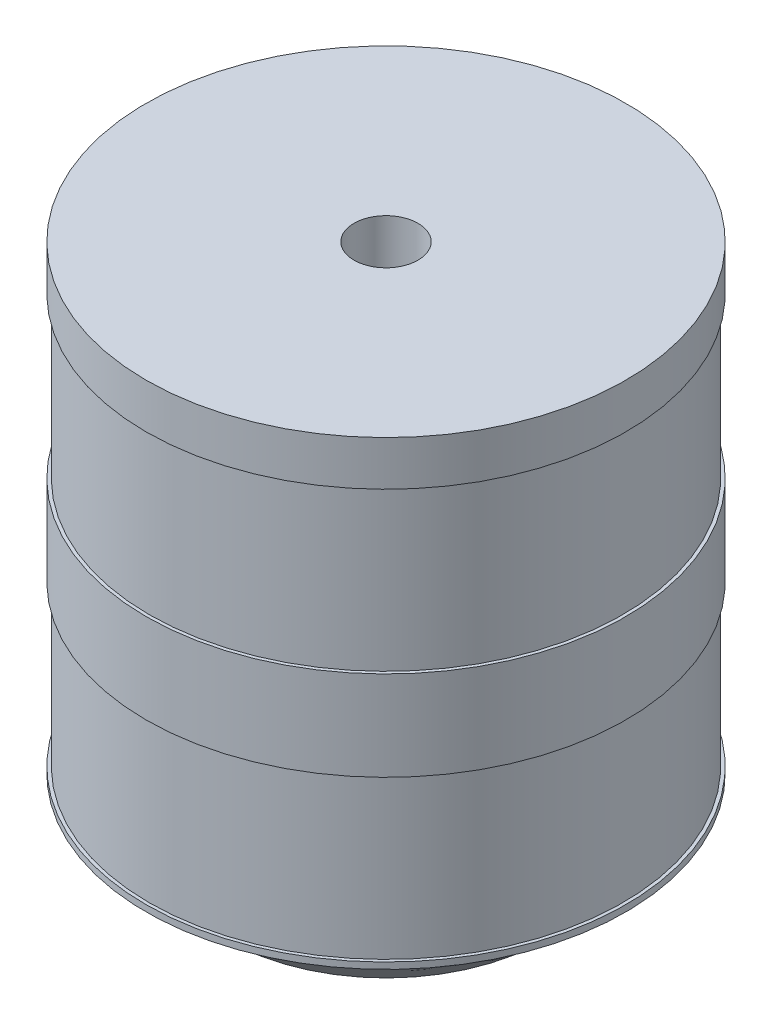
ISO-10303-21;
HEADER;
FILE_DESCRIPTION(('STEP AP214'),'2;1');
FILE_NAME('part.step','',(''),(''),'','','');
FILE_SCHEMA(('AUTOMOTIVE_DESIGN { 1 0 10303 214 1 1 1 1 }'));
ENDSEC;
DATA;
#1=APPLICATION_CONTEXT('core data for automotive mechanical design processes');
#2=APPLICATION_PROTOCOL_DEFINITION('international standard','automotive_design',2000,#1);
#3=PRODUCT_CONTEXT('',#1,'mechanical');
#4=PRODUCT('Part','Part','',(#3));
#5=PRODUCT_RELATED_PRODUCT_CATEGORY('part','',(#4));
#6=PRODUCT_DEFINITION_FORMATION('','',#4);
#7=PRODUCT_DEFINITION_CONTEXT('part definition',#1,'design');
#8=PRODUCT_DEFINITION('design','',#6,#7);
#9=PRODUCT_DEFINITION_SHAPE('','',#8);
#10=(LENGTH_UNIT() NAMED_UNIT(*) SI_UNIT(.MILLI.,.METRE.));
#11=(NAMED_UNIT(*) PLANE_ANGLE_UNIT() SI_UNIT($,.RADIAN.));
#12=(NAMED_UNIT(*) SI_UNIT($,.STERADIAN.) SOLID_ANGLE_UNIT());
#13=UNCERTAINTY_MEASURE_WITH_UNIT(LENGTH_MEASURE(1.E-05),#10,'distance_accuracy_value','');
#14=(GEOMETRIC_REPRESENTATION_CONTEXT(3) GLOBAL_UNCERTAINTY_ASSIGNED_CONTEXT((#13)) GLOBAL_UNIT_ASSIGNED_CONTEXT((#10,
#11,#12)) REPRESENTATION_CONTEXT('',''));
#15=CARTESIAN_POINT('',(0.,0.,0.));
#16=DIRECTION('',(0.,0.,1.));
#17=DIRECTION('',(1.,0.,0.));
#18=AXIS2_PLACEMENT_3D('',#15,#16,#17);
#19=CARTESIAN_POINT('',(0.,72.,0.));
#20=DIRECTION('',(0.,-1.,0.));
#21=DIRECTION('',(0.,0.,-1.));
#22=AXIS2_PLACEMENT_3D('',#19,#20,#21);
#23=CYLINDRICAL_SURFACE('',#22,37.5);
#24=CARTESIAN_POINT('',(0.,26.,0.));
#25=DIRECTION('',(0.,1.,0.));
#26=DIRECTION('',(0.,0.,1.));
#27=AXIS2_PLACEMENT_3D('',#24,#25,#26);
#28=CIRCLE('',#27,37.5);
#29=CARTESIAN_POINT('',(0.,26.,37.5));
#30=VERTEX_POINT('',#29);
#31=EDGE_CURVE('E228',#30,#30,#28,.T.);
#32=ORIENTED_EDGE('',*,*,#31,.T.);
#33=EDGE_LOOP('',(#32));
#34=FACE_BOUND('',#33,.T.);
#35=CARTESIAN_POINT('',(0.,40.,0.));
#36=DIRECTION('',(0.,1.,0.));
#37=DIRECTION('',(0.,0.,1.));
#38=AXIS2_PLACEMENT_3D('',#35,#36,#37);
#39=CIRCLE('',#38,37.5);
#40=CARTESIAN_POINT('',(0.,40.,37.5));
#41=VERTEX_POINT('',#40);
#42=EDGE_CURVE('E52',#41,#41,#39,.T.);
#43=ORIENTED_EDGE('',*,*,#42,.F.);
#44=EDGE_LOOP('',(#43));
#45=FACE_BOUND('',#44,.T.);
#46=ADVANCED_FACE('F43',(#34,#45),#23,.T.);
#47=CARTESIAN_POINT('',(0.,40.,0.));
#48=DIRECTION('',(0.,1.,0.));
#49=DIRECTION('',(0.,0.,1.));
#50=AXIS2_PLACEMENT_3D('',#47,#48,#49);
#51=PLANE('',#50);
#52=CARTESIAN_POINT('',(0.,40.,0.));
#53=DIRECTION('',(0.,1.,0.));
#54=DIRECTION('',(0.,0.,1.));
#55=AXIS2_PLACEMENT_3D('',#52,#53,#54);
#56=CIRCLE('',#55,37.);
#57=CARTESIAN_POINT('',(0.,40.,37.));
#58=VERTEX_POINT('',#57);
#59=EDGE_CURVE('E233',#58,#58,#56,.T.);
#60=ORIENTED_EDGE('',*,*,#59,.F.);
#61=EDGE_LOOP('',(#60));
#62=FACE_BOUND('',#61,.T.);
#63=ORIENTED_EDGE('',*,*,#42,.T.);
#64=EDGE_LOOP('',(#63));
#65=FACE_BOUND('',#64,.T.);
#66=ADVANCED_FACE('F193',(#62,#65),#51,.T.);
#67=CARTESIAN_POINT('',(0.,65.,0.));
#68=DIRECTION('',(0.,1.,0.));
#69=DIRECTION('',(0.,0.,1.));
#70=AXIS2_PLACEMENT_3D('',#67,#68,#69);
#71=PLANE('',#70);
#72=CARTESIAN_POINT('',(0.,65.,0.));
#73=DIRECTION('',(0.,1.,0.));
#74=DIRECTION('',(0.,0.,1.));
#75=AXIS2_PLACEMENT_3D('',#72,#73,#74);
#76=CIRCLE('',#75,37.);
#77=CARTESIAN_POINT('',(0.,65.,37.));
#78=VERTEX_POINT('',#77);
#79=EDGE_CURVE('E227',#78,#78,#76,.T.);
#80=ORIENTED_EDGE('',*,*,#79,.T.);
#81=EDGE_LOOP('',(#80));
#82=FACE_BOUND('',#81,.T.);
#83=CARTESIAN_POINT('',(0.,65.,0.));
#84=DIRECTION('',(0.,1.,0.));
#85=DIRECTION('',(0.,0.,1.));
#86=AXIS2_PLACEMENT_3D('',#83,#84,#85);
#87=CIRCLE('',#86,37.5);
#88=CARTESIAN_POINT('',(0.,65.,37.5));
#89=VERTEX_POINT('',#88);
#90=EDGE_CURVE('E243',#89,#89,#87,.T.);
#91=ORIENTED_EDGE('',*,*,#90,.F.);
#92=EDGE_LOOP('',(#91));
#93=FACE_BOUND('',#92,.T.);
#94=ADVANCED_FACE('F191',(#82,#93),#71,.F.);
#95=CARTESIAN_POINT('',(0.,40.,0.));
#96=DIRECTION('',(0.,1.,0.));
#97=DIRECTION('',(0.,0.,1.));
#98=AXIS2_PLACEMENT_3D('',#95,#96,#97);
#99=CYLINDRICAL_SURFACE('',#98,37.);
#100=ORIENTED_EDGE('',*,*,#59,.T.);
#101=EDGE_LOOP('',(#100));
#102=FACE_BOUND('',#101,.T.);
#103=ORIENTED_EDGE('',*,*,#79,.F.);
#104=EDGE_LOOP('',(#103));
#105=FACE_BOUND('',#104,.T.);
#106=ADVANCED_FACE('F187',(#102,#105),#99,.T.);
#107=CARTESIAN_POINT('',(0.,72.,0.));
#108=DIRECTION('',(0.,1.,0.));
#109=DIRECTION('',(0.,0.,1.));
#110=AXIS2_PLACEMENT_3D('',#107,#108,#109);
#111=PLANE('',#110);
#112=CARTESIAN_POINT('',(0.,72.,0.));
#113=DIRECTION('',(0.,1.,0.));
#114=DIRECTION('',(0.,0.,1.));
#115=AXIS2_PLACEMENT_3D('',#112,#113,#114);
#116=CIRCLE('',#115,5.);
#117=CARTESIAN_POINT('',(0.,72.,5.));
#118=VERTEX_POINT('',#117);
#119=EDGE_CURVE('E130',#118,#118,#116,.T.);
#120=ORIENTED_EDGE('',*,*,#119,.F.);
#121=EDGE_LOOP('',(#120));
#122=FACE_BOUND('',#121,.T.);
#123=CARTESIAN_POINT('',(0.,72.,0.));
#124=DIRECTION('',(0.,1.,0.));
#125=DIRECTION('',(0.,0.,1.));
#126=AXIS2_PLACEMENT_3D('',#123,#124,#125);
#127=CIRCLE('',#126,37.5);
#128=CARTESIAN_POINT('',(0.,72.,37.5));
#129=VERTEX_POINT('',#128);
#130=EDGE_CURVE('E12',#129,#129,#127,.T.);
#131=ORIENTED_EDGE('',*,*,#130,.T.);
#132=EDGE_LOOP('',(#131));
#133=FACE_BOUND('',#132,.T.);
#134=ADVANCED_FACE('F190',(#122,#133),#111,.T.);
#135=ORIENTED_EDGE('',*,*,#90,.T.);
#136=EDGE_LOOP('',(#135));
#137=FACE_BOUND('',#136,.T.);
#138=ORIENTED_EDGE('',*,*,#130,.F.);
#139=EDGE_LOOP('',(#138));
#140=FACE_BOUND('',#139,.T.);
#141=ADVANCED_FACE('F45',(#137,#140),#23,.T.);
#142=CARTESIAN_POINT('',(0.,0.999999999999987,0.));
#143=DIRECTION('',(0.,1.,0.));
#144=DIRECTION('',(0.,0.,1.));
#145=AXIS2_PLACEMENT_3D('',#142,#143,#144);
#146=PLANE('',#145);
#147=CARTESIAN_POINT('',(0.,0.999999999999987,0.));
#148=DIRECTION('',(0.,1.,0.));
#149=DIRECTION('',(0.,0.,1.));
#150=AXIS2_PLACEMENT_3D('',#147,#148,#149);
#151=CIRCLE('',#150,37.);
#152=CARTESIAN_POINT('',(0.,0.999999999999987,37.));
#153=VERTEX_POINT('',#152);
#154=EDGE_CURVE('E235',#153,#153,#151,.T.);
#155=ORIENTED_EDGE('',*,*,#154,.F.);
#156=EDGE_LOOP('',(#155));
#157=FACE_BOUND('',#156,.T.);
#158=CARTESIAN_POINT('',(0.,0.999999999999987,0.));
#159=DIRECTION('',(0.,1.,0.));
#160=DIRECTION('',(0.,0.,1.));
#161=AXIS2_PLACEMENT_3D('',#158,#159,#160);
#162=CIRCLE('',#161,37.5);
#163=CARTESIAN_POINT('',(0.,0.999999999999987,37.5));
#164=VERTEX_POINT('',#163);
#165=EDGE_CURVE('E224',#164,#164,#162,.T.);
#166=ORIENTED_EDGE('',*,*,#165,.T.);
#167=EDGE_LOOP('',(#166));
#168=FACE_BOUND('',#167,.T.);
#169=ADVANCED_FACE('F180',(#157,#168),#146,.T.);
#170=CARTESIAN_POINT('',(0.,26.,0.));
#171=DIRECTION('',(0.,1.,0.));
#172=DIRECTION('',(0.,0.,1.));
#173=AXIS2_PLACEMENT_3D('',#170,#171,#172);
#174=PLANE('',#173);
#175=CARTESIAN_POINT('',(0.,26.,0.));
#176=DIRECTION('',(0.,1.,0.));
#177=DIRECTION('',(0.,0.,1.));
#178=AXIS2_PLACEMENT_3D('',#175,#176,#177);
#179=CIRCLE('',#178,37.);
#180=CARTESIAN_POINT('',(0.,26.,37.));
#181=VERTEX_POINT('',#180);
#182=EDGE_CURVE('E238',#181,#181,#179,.T.);
#183=ORIENTED_EDGE('',*,*,#182,.T.);
#184=EDGE_LOOP('',(#183));
#185=FACE_BOUND('',#184,.T.);
#186=ORIENTED_EDGE('',*,*,#31,.F.);
#187=EDGE_LOOP('',(#186));
#188=FACE_BOUND('',#187,.T.);
#189=ADVANCED_FACE('F178',(#185,#188),#174,.F.);
#190=CARTESIAN_POINT('',(0.,0.999999999999987,0.));
#191=DIRECTION('',(0.,1.,0.));
#192=DIRECTION('',(0.,0.,1.));
#193=AXIS2_PLACEMENT_3D('',#190,#191,#192);
#194=CYLINDRICAL_SURFACE('',#193,37.);
#195=ORIENTED_EDGE('',*,*,#154,.T.);
#196=EDGE_LOOP('',(#195));
#197=FACE_BOUND('',#196,.T.);
#198=ORIENTED_EDGE('',*,*,#182,.F.);
#199=EDGE_LOOP('',(#198));
#200=FACE_BOUND('',#199,.T.);
#201=ADVANCED_FACE('F169',(#197,#200),#194,.T.);
#202=CARTESIAN_POINT('',(0.,0.,0.));
#203=DIRECTION('',(0.,1.,0.));
#204=DIRECTION('',(0.,0.,1.));
#205=AXIS2_PLACEMENT_3D('',#202,#203,#204);
#206=CIRCLE('',#205,37.5);
#207=CARTESIAN_POINT('',(-12.502949145602,0.,35.3542962405206));
#208=VERTEX_POINT('',#207);
#209=EDGE_CURVE('E151',#208,#208,#206,.F.);
#210=ORIENTED_EDGE('',*,*,#209,.F.);
#211=EDGE_LOOP('',(#210));
#212=FACE_BOUND('',#211,.T.);
#213=ORIENTED_EDGE('',*,*,#165,.F.);
#214=EDGE_LOOP('',(#213));
#215=FACE_BOUND('',#214,.T.);
#216=ADVANCED_FACE('F177',(#212,#215),#23,.T.);
#217=CARTESIAN_POINT('',(0.,-10.,0.));
#218=DIRECTION('',(0.,-1.,0.));
#219=DIRECTION('',(0.,0.,-1.));
#220=AXIS2_PLACEMENT_3D('',#217,#218,#219);
#221=PLANE('',#220);
#222=DIRECTION('',(0.,0.,1.));
#223=VECTOR('',#222,1.);
#224=CARTESIAN_POINT('',(5.,-10.,-20.));
#225=LINE('',#224,#223);
#226=CARTESIAN_POINT('',(5.,-10.,-20.));
#227=VERTEX_POINT('',#226);
#228=CARTESIAN_POINT('',(5.,-10.,20.));
#229=VERTEX_POINT('',#228);
#230=EDGE_CURVE('E59',#227,#229,#225,.T.);
#231=ORIENTED_EDGE('',*,*,#230,.F.);
#232=DIRECTION('',(1.,0.,0.));
#233=VECTOR('',#232,1.);
#234=CARTESIAN_POINT('',(-5.,-10.,-20.));
#235=LINE('',#234,#233);
#236=CARTESIAN_POINT('',(-5.,-10.,-20.));
#237=VERTEX_POINT('',#236);
#238=EDGE_CURVE('E114',#237,#227,#235,.T.);
#239=ORIENTED_EDGE('',*,*,#238,.F.);
#240=DIRECTION('',(0.,0.,-1.));
#241=VECTOR('',#240,1.);
#242=CARTESIAN_POINT('',(-5.,-10.,-20.));
#243=LINE('',#242,#241);
#244=CARTESIAN_POINT('',(-5.,-10.,20.));
#245=VERTEX_POINT('',#244);
#246=EDGE_CURVE('E123',#245,#237,#243,.T.);
#247=ORIENTED_EDGE('',*,*,#246,.F.);
#248=DIRECTION('',(-1.,0.,0.));
#249=VECTOR('',#248,1.);
#250=CARTESIAN_POINT('',(-5.,-10.,20.));
#251=LINE('',#250,#249);
#252=EDGE_CURVE('E94',#229,#245,#251,.T.);
#253=ORIENTED_EDGE('',*,*,#252,.F.);
#254=EDGE_LOOP('',(#231,#239,#247,#253));
#255=FACE_BOUND('',#254,.T.);
#256=CARTESIAN_POINT('',(0.,-10.,0.));
#257=DIRECTION('',(0.,-1.,0.));
#258=DIRECTION('',(0.,0.,-1.));
#259=AXIS2_PLACEMENT_3D('',#256,#257,#258);
#260=CIRCLE('',#259,25.);
#261=CARTESIAN_POINT('',(-14.7707747604688,-10.,20.169883811651));
#262=VERTEX_POINT('',#261);
#263=EDGE_CURVE('E139',#262,#262,#260,.T.);
#264=ORIENTED_EDGE('',*,*,#263,.T.);
#265=EDGE_LOOP('',(#264));
#266=FACE_BOUND('',#265,.T.);
#267=ADVANCED_FACE('F166',(#255,#266),#221,.T.);
#268=CARTESIAN_POINT('',(-14.7707747604688,-10.,20.169883811651));
#269=CARTESIAN_POINT('',(-12.502949145602,0.,35.3542962405206));
#270=CARTESIAN_POINT('',(25.5689928628332,-10.,49.7114333325885));
#271=CARTESIAN_POINT('',(58.2056433354393,0.,60.3601945317245));
#272=CARTESIAN_POINT('',(55.1105423837707,-10.,9.37166570928654));
#273=CARTESIAN_POINT('',(83.2115416266432,0.,-10.3483979493167));
#274=CARTESIAN_POINT('',(14.7707747604688,-10.,-20.169883811651));
#275=CARTESIAN_POINT('',(12.5029491456019,0.,-35.3542962405206));
#276=CARTESIAN_POINT('',(-25.5689928628331,-10.,-49.7114333325884));
#277=CARTESIAN_POINT('',(-58.2056433354393,0.,-60.3601945317245));
#278=CARTESIAN_POINT('',(-55.1105423837706,-10.,-9.37166570928654));
#279=CARTESIAN_POINT('',(-83.2115416266432,0.,10.3483979493167));
#280=CARTESIAN_POINT('',(-14.7707747604688,-10.,20.169883811651));
#281=CARTESIAN_POINT('',(-12.502949145602,0.,35.3542962405206));
#282=(BOUNDED_SURFACE() B_SPLINE_SURFACE(3,1,((#268,#269),(#270,#271),(#272,#273),(#274,#275),
(#276,#277),(#278,#279),(#280,#281)),.UNSPECIFIED.,.T.,.F.,.F.) B_SPLINE_SURFACE_WITH_KNOTS((4,
3,4),(2,2),(0.,0.5,1.),(0.,1.),
.UNSPECIFIED.) GEOMETRIC_REPRESENTATION_ITEM() RATIONAL_B_SPLINE_SURFACE(((1.,1.),
(0.333333333333333,0.333333333333333),(0.333333333333333,0.333333333333333),(1.,1.),
(0.333333333333334,0.333333333333333),(0.333333333333334,0.333333333333333),(1.,1.))) REPRESENTATION_ITEM('') SURFACE());
#283=CARTESIAN_POINT('',(-14.7707747604688,-10.,20.169883811651));
#284=CARTESIAN_POINT('',(-14.7471515769806,-9.89583333333333,20.3280547744517));
#285=CARTESIAN_POINT('',(-14.7235283934924,-9.79166666666667,20.4862257372524));
#286=CARTESIAN_POINT('',(-14.676282026516,-9.58333333333333,20.8025676628539));
#287=CARTESIAN_POINT('',(-14.6526588430278,-9.47916666666667,20.9607386256546));
#288=CARTESIAN_POINT('',(-14.6054124760514,-9.27083333333333,21.277080551256));
#289=CARTESIAN_POINT('',(-14.5817892925632,-9.16666666666666,21.4352515140568));
#290=CARTESIAN_POINT('',(-14.5345429255868,-8.95833333333333,21.7515934396582));
#291=CARTESIAN_POINT('',(-14.5109197420986,-8.85416666666667,21.9097644024589));
#292=CARTESIAN_POINT('',(-14.4636733751222,-8.64583333333334,22.2261063280604));
#293=CARTESIAN_POINT('',(-14.440050191634,-8.54166666666667,22.3842772908611));
#294=CARTESIAN_POINT('',(-14.3928038246576,-8.33333333333333,22.7006192164626));
#295=CARTESIAN_POINT('',(-14.3691806411694,-8.22916666666667,22.8587901792633));
#296=CARTESIAN_POINT('',(-14.321934274193,-8.02083333333333,23.1751321048648));
#297=CARTESIAN_POINT('',(-14.2983110907048,-7.91666666666667,23.3333030676655));
#298=CARTESIAN_POINT('',(-14.2510647237284,-7.70833333333333,23.6496449932669));
#299=CARTESIAN_POINT('',(-14.2274415402402,-7.60416666666667,23.8078159560677));
#300=CARTESIAN_POINT('',(-14.1801951732639,-7.39583333333333,24.1241578816691));
#301=CARTESIAN_POINT('',(-14.1565719897757,-7.29166666666667,24.2823288444698));
#302=CARTESIAN_POINT('',(-14.1093256227993,-7.08333333333333,24.5986707700713));
#303=CARTESIAN_POINT('',(-14.0857024393111,-6.97916666666667,24.756841732872));
#304=CARTESIAN_POINT('',(-14.0384560723347,-6.77083333333333,25.0731836584735));
#305=CARTESIAN_POINT('',(-14.0148328888465,-6.66666666666667,25.2313546212742));
#306=CARTESIAN_POINT('',(-13.9675865218701,-6.45833333333333,25.5476965468756));
#307=CARTESIAN_POINT('',(-13.9439633383819,-6.35416666666667,25.7058675096764));
#308=CARTESIAN_POINT('',(-13.8967169714055,-6.14583333333333,26.0222094352778));
#309=CARTESIAN_POINT('',(-13.8730937879173,-6.04166666666667,26.1803803980785));
#310=CARTESIAN_POINT('',(-13.8258474209409,-5.83333333333333,26.49672232368));
#311=CARTESIAN_POINT('',(-13.8022242374527,-5.72916666666667,26.6548932864807));
#312=CARTESIAN_POINT('',(-13.7549778704763,-5.52083333333333,26.9712352120822));
#313=CARTESIAN_POINT('',(-13.7313546869881,-5.41666666666667,27.1294061748829));
#314=CARTESIAN_POINT('',(-13.6841083200117,-5.20833333333333,27.4457481004843));
#315=CARTESIAN_POINT('',(-13.6604851365235,-5.10416666666667,27.6039190632851));
#316=CARTESIAN_POINT('',(-13.6132387695472,-4.89583333333333,27.9202609888865));
#317=CARTESIAN_POINT('',(-13.589615586059,-4.79166666666667,28.0784319516873));
#318=CARTESIAN_POINT('',(-13.5423692190826,-4.58333333333333,28.3947738772887));
#319=CARTESIAN_POINT('',(-13.5187460355944,-4.47916666666667,28.5529448400894));
#320=CARTESIAN_POINT('',(-13.471499668618,-4.27083333333333,28.8692867656909));
#321=CARTESIAN_POINT('',(-13.4478764851298,-4.16666666666667,29.0274577284916));
#322=CARTESIAN_POINT('',(-13.4006301181534,-3.95833333333333,29.3437996540931));
#323=CARTESIAN_POINT('',(-13.3770069346652,-3.85416666666667,29.5019706168938));
#324=CARTESIAN_POINT('',(-13.3297605676888,-3.64583333333333,29.8183125424952));
#325=CARTESIAN_POINT('',(-13.3061373842006,-3.54166666666667,29.976483505296));
#326=CARTESIAN_POINT('',(-13.2588910172242,-3.33333333333333,30.2928254308974));
#327=CARTESIAN_POINT('',(-13.235267833736,-3.22916666666667,30.4509963936981));
#328=CARTESIAN_POINT('',(-13.1880214667596,-3.02083333333333,30.7673383192996));
#329=CARTESIAN_POINT('',(-13.1643982832714,-2.91666666666667,30.9255092821003));
#330=CARTESIAN_POINT('',(-13.117151916295,-2.70833333333333,31.2418512077018));
#331=CARTESIAN_POINT('',(-13.0935287328068,-2.60416666666667,31.4000221705025));
#332=CARTESIAN_POINT('',(-13.0462823658305,-2.39583333333333,31.7163640961039));
#333=CARTESIAN_POINT('',(-13.0226591823423,-2.29166666666667,31.8745350589047));
#334=CARTESIAN_POINT('',(-12.9754128153659,-2.08333333333333,32.1908769845061));
#335=CARTESIAN_POINT('',(-12.9517896318777,-1.97916666666667,32.3490479473069));
#336=CARTESIAN_POINT('',(-12.9045432649013,-1.77083333333333,32.6653898729083));
#337=CARTESIAN_POINT('',(-12.8809200814131,-1.66666666666667,32.823560835709));
#338=CARTESIAN_POINT('',(-12.8336737144367,-1.45833333333333,33.1399027613105));
#339=CARTESIAN_POINT('',(-12.8100505309485,-1.35416666666667,33.2980737241112));
#340=CARTESIAN_POINT('',(-12.7628041639721,-1.14583333333333,33.6144156497127));
#341=CARTESIAN_POINT('',(-12.7391809804839,-1.04166666666667,33.7725866125134));
#342=CARTESIAN_POINT('',(-12.6919346135075,-0.833333333333333,34.0889285381148));
#343=CARTESIAN_POINT('',(-12.6683114300193,-0.729166666666667,34.2470995009156));
#344=CARTESIAN_POINT('',(-12.6210650630429,-0.520833333333334,34.563441426517));
#345=CARTESIAN_POINT('',(-12.5974418795547,-0.416666666666667,34.7216123893177));
#346=CARTESIAN_POINT('',(-12.5501955125783,-0.208333333333332,35.0379543149192));
#347=CARTESIAN_POINT('',(-12.5265723290901,-0.104166666666665,35.1961252777199));
#348=CARTESIAN_POINT('',(-12.502949145602,0.,35.3542962405206));
#349=B_SPLINE_CURVE_WITH_KNOTS('',3,(#283,#284,#285,#286,#287,#288,#289,#290,#291,#292,#293,
#294,#295,#296,#297,#298,#299,#300,#301,#302,#303,#304,#305,#306,#307,#308,#309,#310,#311,#312,
#313,#314,#315,#316,#317,#318,#319,#320,#321,#322,#323,#324,#325,#326,#327,#328,#329,#330,#331,
#332,#333,#334,#335,#336,#337,#338,#339,#340,#341,#342,#343,#344,#345,#346,#347,#348),
.UNSPECIFIED.,.F.,.F.,(4,2,2,2,2,2,2,2,2,2,2,2,2,2,2,2,2,2,2,2,2,2,2,2,2,2,2,2,2,2,2,2,4),(0.,
0.572574208677644,1.14514841735529,1.71772262603293,2.29029683471057,2.86287104338822,
3.43544525206586,4.00801946074351,4.58059366942115,5.1531678780988,5.72574208677644,
6.29831629545408,6.87089050413172,7.44346471280937,8.01603892148701,8.58861313016466,
9.1611873388423,9.73376154751995,10.3063357561976,10.8789099648752,11.4514841735529,
12.0240583822305,12.5966325909082,13.1692067995858,13.7417810082634,14.3143552169411,
14.8869294256187,15.4595036342964,16.032077842974,16.6046520516517,17.1772262603293,
17.7498004690069,18.3223746776846),.UNSPECIFIED.);
#350=EDGE_CURVE('BSEAM153',#262,#208,#349,.T.);
#351=ORIENTED_EDGE('',*,*,#263,.F.);
#352=ORIENTED_EDGE('',*,*,#209,.T.);
#353=ORIENTED_EDGE('',*,*,#350,.T.);
#354=ORIENTED_EDGE('',*,*,#350,.F.);
#355=EDGE_LOOP('',(#351,#353,#352,#354));
#356=FACE_BOUND('',#355,.T.);
#357=ADVANCED_FACE('F153',(#356),#282,.T.);
#358=CARTESIAN_POINT('',(0.,1.99999999999999,0.));
#359=DIRECTION('',(0.,1.,0.));
#360=DIRECTION('',(0.,0.,1.));
#361=AXIS2_PLACEMENT_3D('',#358,#359,#360);
#362=CYLINDRICAL_SURFACE('',#361,5.);
#363=CARTESIAN_POINT('',(0.,1.99999999999999,0.));
#364=DIRECTION('',(0.,1.,0.));
#365=DIRECTION('',(0.,0.,1.));
#366=AXIS2_PLACEMENT_3D('',#363,#364,#365);
#367=CIRCLE('',#366,5.);
#368=CARTESIAN_POINT('',(0.,1.99999999999999,5.));
#369=VERTEX_POINT('',#368);
#370=EDGE_CURVE('E135',#369,#369,#367,.T.);
#371=ORIENTED_EDGE('',*,*,#370,.F.);
#372=EDGE_LOOP('',(#371));
#373=FACE_BOUND('',#372,.T.);
#374=ORIENTED_EDGE('',*,*,#119,.T.);
#375=EDGE_LOOP('',(#374));
#376=FACE_BOUND('',#375,.T.);
#377=ADVANCED_FACE('F165',(#373,#376),#362,.F.);
#378=CARTESIAN_POINT('',(0.,1.99999999999999,0.));
#379=DIRECTION('',(0.,1.,0.));
#380=DIRECTION('',(0.,0.,1.));
#381=AXIS2_PLACEMENT_3D('',#378,#379,#380);
#382=PLANE('',#381);
#383=ORIENTED_EDGE('',*,*,#370,.T.);
#384=EDGE_LOOP('',(#383));
#385=FACE_BOUND('',#384,.T.);
#386=ADVANCED_FACE('F294',(#385),#382,.T.);
#387=CARTESIAN_POINT('',(5.,-5.,-20.));
#388=DIRECTION('',(1.,0.,0.));
#389=DIRECTION('',(0.,0.,-1.));
#390=AXIS2_PLACEMENT_3D('',#387,#388,#389);
#391=PLANE('',#390);
#392=ORIENTED_EDGE('',*,*,#230,.T.);
#393=DIRECTION('',(0.,-1.,0.));
#394=VECTOR('',#393,1.);
#395=CARTESIAN_POINT('',(5.,-5.,20.));
#396=LINE('',#395,#394);
#397=CARTESIAN_POINT('',(5.,-5.,20.));
#398=VERTEX_POINT('',#397);
#399=EDGE_CURVE('E82',#398,#229,#396,.T.);
#400=ORIENTED_EDGE('',*,*,#399,.F.);
#401=DIRECTION('',(0.,0.,1.));
#402=VECTOR('',#401,1.);
#403=CARTESIAN_POINT('',(5.,-5.,-20.));
#404=LINE('',#403,#402);
#405=CARTESIAN_POINT('',(5.,-5.,-20.));
#406=VERTEX_POINT('',#405);
#407=EDGE_CURVE('E110',#406,#398,#404,.T.);
#408=ORIENTED_EDGE('',*,*,#407,.F.);
#409=DIRECTION('',(0.,-1.,0.));
#410=VECTOR('',#409,1.);
#411=CARTESIAN_POINT('',(5.,-5.,-20.));
#412=LINE('',#411,#410);
#413=EDGE_CURVE('E67',#406,#227,#412,.T.);
#414=ORIENTED_EDGE('',*,*,#413,.T.);
#415=EDGE_LOOP('',(#392,#400,#408,#414));
#416=FACE_BOUND('',#415,.T.);
#417=ADVANCED_FACE('F287',(#416),#391,.F.);
#418=CARTESIAN_POINT('',(-5.,-5.,-20.));
#419=DIRECTION('',(0.,0.,-1.));
#420=DIRECTION('',(-1.,0.,0.));
#421=AXIS2_PLACEMENT_3D('',#418,#419,#420);
#422=PLANE('',#421);
#423=ORIENTED_EDGE('',*,*,#238,.T.);
#424=ORIENTED_EDGE('',*,*,#413,.F.);
#425=DIRECTION('',(1.,0.,0.));
#426=VECTOR('',#425,1.);
#427=CARTESIAN_POINT('',(-5.,-5.,-20.));
#428=LINE('',#427,#426);
#429=CARTESIAN_POINT('',(-5.,-5.,-20.));
#430=VERTEX_POINT('',#429);
#431=EDGE_CURVE('E107',#430,#406,#428,.T.);
#432=ORIENTED_EDGE('',*,*,#431,.F.);
#433=DIRECTION('',(0.,-1.,0.));
#434=VECTOR('',#433,1.);
#435=CARTESIAN_POINT('',(-5.,-5.,-20.));
#436=LINE('',#435,#434);
#437=EDGE_CURVE('E99',#430,#237,#436,.T.);
#438=ORIENTED_EDGE('',*,*,#437,.T.);
#439=EDGE_LOOP('',(#423,#424,#432,#438));
#440=FACE_BOUND('',#439,.T.);
#441=ADVANCED_FACE('F285',(#440),#422,.F.);
#442=CARTESIAN_POINT('',(-5.,-5.,-20.));
#443=DIRECTION('',(-1.,0.,0.));
#444=DIRECTION('',(0.,0.,1.));
#445=AXIS2_PLACEMENT_3D('',#442,#443,#444);
#446=PLANE('',#445);
#447=ORIENTED_EDGE('',*,*,#246,.T.);
#448=ORIENTED_EDGE('',*,*,#437,.F.);
#449=DIRECTION('',(0.,0.,-1.));
#450=VECTOR('',#449,1.);
#451=CARTESIAN_POINT('',(-5.,-5.,-20.));
#452=LINE('',#451,#450);
#453=CARTESIAN_POINT('',(-5.,-5.,20.));
#454=VERTEX_POINT('',#453);
#455=EDGE_CURVE('E102',#454,#430,#452,.T.);
#456=ORIENTED_EDGE('',*,*,#455,.F.);
#457=DIRECTION('',(0.,-1.,0.));
#458=VECTOR('',#457,1.);
#459=CARTESIAN_POINT('',(-5.,-5.,20.));
#460=LINE('',#459,#458);
#461=EDGE_CURVE('E87',#454,#245,#460,.T.);
#462=ORIENTED_EDGE('',*,*,#461,.T.);
#463=EDGE_LOOP('',(#447,#448,#456,#462));
#464=FACE_BOUND('',#463,.T.);
#465=ADVANCED_FACE('F103',(#464),#446,.F.);
#466=CARTESIAN_POINT('',(-5.,-5.,20.));
#467=DIRECTION('',(0.,0.,1.));
#468=DIRECTION('',(1.,0.,0.));
#469=AXIS2_PLACEMENT_3D('',#466,#467,#468);
#470=PLANE('',#469);
#471=ORIENTED_EDGE('',*,*,#252,.T.);
#472=ORIENTED_EDGE('',*,*,#461,.F.);
#473=DIRECTION('',(-1.,0.,0.));
#474=VECTOR('',#473,1.);
#475=CARTESIAN_POINT('',(-5.,-5.,20.));
#476=LINE('',#475,#474);
#477=EDGE_CURVE('E91',#398,#454,#476,.T.);
#478=ORIENTED_EDGE('',*,*,#477,.F.);
#479=ORIENTED_EDGE('',*,*,#399,.T.);
#480=EDGE_LOOP('',(#471,#472,#478,#479));
#481=FACE_BOUND('',#480,.T.);
#482=ADVANCED_FACE('F89',(#481),#470,.F.);
#483=CARTESIAN_POINT('',(0.,-5.,0.));
#484=DIRECTION('',(0.,1.,0.));
#485=DIRECTION('',(0.,0.,1.));
#486=AXIS2_PLACEMENT_3D('',#483,#484,#485);
#487=PLANE('',#486);
#488=ORIENTED_EDGE('',*,*,#407,.T.);
#489=ORIENTED_EDGE('',*,*,#477,.T.);
#490=ORIENTED_EDGE('',*,*,#455,.T.);
#491=ORIENTED_EDGE('',*,*,#431,.T.);
#492=EDGE_LOOP('',(#488,#489,#490,#491));
#493=FACE_BOUND('',#492,.T.);
#494=ADVANCED_FACE('F109',(#493),#487,.F.);
#495=CLOSED_SHELL('',(#46,#66,#94,#106,#134,#141,#169,#189,#201,#216,#267,#357,#377,#386,#417,
#441,#465,#482,#494));
#496=MANIFOLD_SOLID_BREP('B2',#495);
#497=ADVANCED_BREP_SHAPE_REPRESENTATION('',(#18,#496),#14);
#498=SHAPE_DEFINITION_REPRESENTATION(#9,#497);
ENDSEC;
END-ISO-10303-21;
